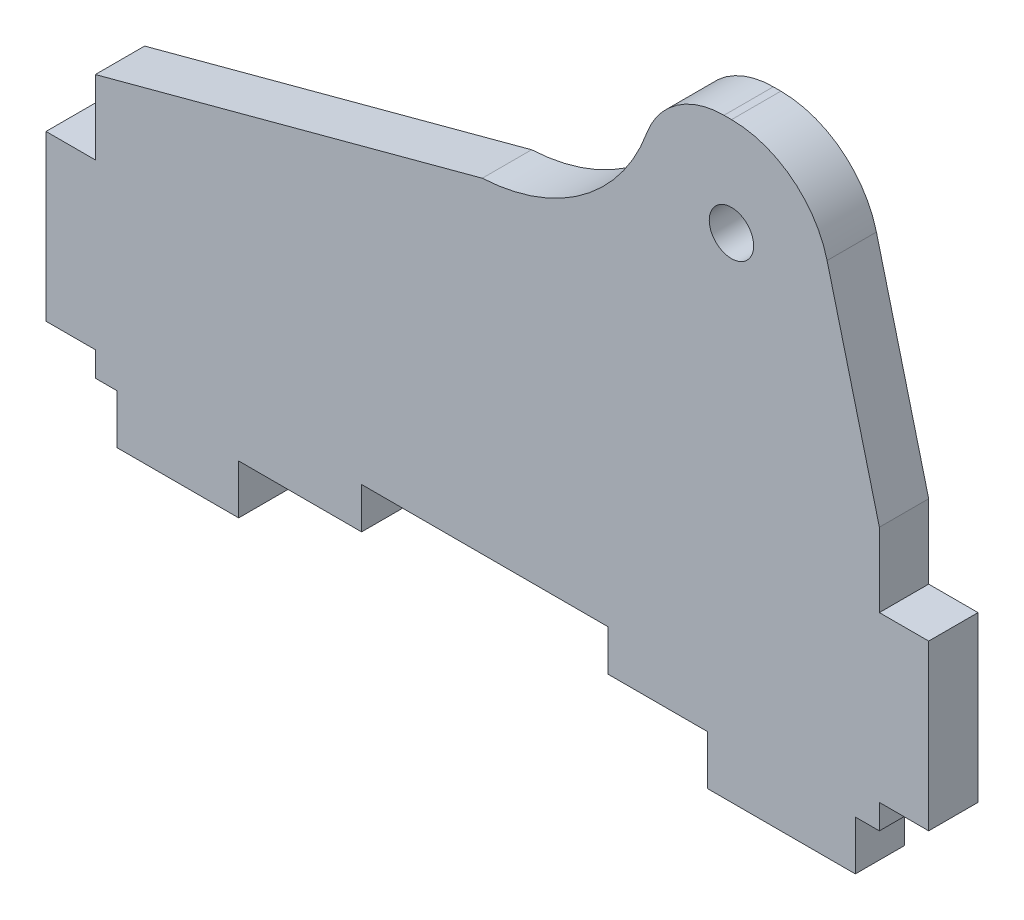
ISO-10303-21;
HEADER;
FILE_DESCRIPTION(('STEP AP214'),'2;1');
FILE_NAME('part.step','',(''),(''),'','','');
FILE_SCHEMA(('AUTOMOTIVE_DESIGN { 1 0 10303 214 1 1 1 1 }'));
ENDSEC;
DATA;
#1=APPLICATION_CONTEXT('core data for automotive mechanical design processes');
#2=APPLICATION_PROTOCOL_DEFINITION('international standard','automotive_design',2000,#1);
#3=PRODUCT_CONTEXT('',#1,'mechanical');
#4=PRODUCT('Part','Part','',(#3));
#5=PRODUCT_RELATED_PRODUCT_CATEGORY('part','',(#4));
#6=PRODUCT_DEFINITION_FORMATION('','',#4);
#7=PRODUCT_DEFINITION_CONTEXT('part definition',#1,'design');
#8=PRODUCT_DEFINITION('design','',#6,#7);
#9=PRODUCT_DEFINITION_SHAPE('','',#8);
#10=(LENGTH_UNIT() NAMED_UNIT(*) SI_UNIT(.MILLI.,.METRE.));
#11=(NAMED_UNIT(*) PLANE_ANGLE_UNIT() SI_UNIT($,.RADIAN.));
#12=(NAMED_UNIT(*) SI_UNIT($,.STERADIAN.) SOLID_ANGLE_UNIT());
#13=UNCERTAINTY_MEASURE_WITH_UNIT(LENGTH_MEASURE(1.E-05),#10,'distance_accuracy_value','');
#14=(GEOMETRIC_REPRESENTATION_CONTEXT(3) GLOBAL_UNCERTAINTY_ASSIGNED_CONTEXT((#13)) GLOBAL_UNIT_ASSIGNED_CONTEXT((#10,
#11,#12)) REPRESENTATION_CONTEXT('',''));
#15=CARTESIAN_POINT('',(0.,0.,0.));
#16=DIRECTION('',(0.,0.,1.));
#17=DIRECTION('',(1.,0.,0.));
#18=AXIS2_PLACEMENT_3D('',#15,#16,#17);
#19=CARTESIAN_POINT('',(41.246222878878,26.4756,3.));
#20=DIRECTION('',(0.,0.,-1.));
#21=DIRECTION('',(-1.,0.,0.));
#22=AXIS2_PLACEMENT_3D('',#19,#20,#21);
#23=CYLINDRICAL_SURFACE('',#22,4.99999999999999);
#24=CARTESIAN_POINT('',(41.246222878878,26.4756,0.));
#25=DIRECTION('',(0.,0.,-1.));
#26=DIRECTION('',(-1.,0.,0.));
#27=AXIS2_PLACEMENT_3D('',#24,#25,#26);
#28=CIRCLE('',#27,4.99999999999999);
#29=CARTESIAN_POINT('',(36.5489090063937,28.1888549090451,0.));
#30=VERTEX_POINT('',#29);
#31=CARTESIAN_POINT('',(41.246222878878,31.4756,0.));
#32=VERTEX_POINT('',#31);
#33=EDGE_CURVE('E260',#30,#32,#28,.T.);
#34=ORIENTED_EDGE('',*,*,#33,.F.);
#35=DIRECTION('',(0.,0.,-1.));
#36=VECTOR('',#35,1.);
#37=CARTESIAN_POINT('',(36.5489090063937,28.1888549090451,3.));
#38=LINE('',#37,#36);
#39=CARTESIAN_POINT('',(36.5489090063937,28.1888549090451,3.));
#40=VERTEX_POINT('',#39);
#41=EDGE_CURVE('E11',#40,#30,#38,.T.);
#42=ORIENTED_EDGE('',*,*,#41,.F.);
#43=CARTESIAN_POINT('',(41.246222878878,26.4756,3.));
#44=DIRECTION('',(0.,0.,-1.));
#45=DIRECTION('',(-1.,0.,0.));
#46=AXIS2_PLACEMENT_3D('',#43,#44,#45);
#47=CIRCLE('',#46,4.99999999999999);
#48=CARTESIAN_POINT('',(41.246222878878,31.4756,3.));
#49=VERTEX_POINT('',#48);
#50=EDGE_CURVE('E344',#40,#49,#47,.T.);
#51=ORIENTED_EDGE('',*,*,#50,.T.);
#52=DIRECTION('',(0.,0.,-1.));
#53=VECTOR('',#52,1.);
#54=CARTESIAN_POINT('',(41.246222878878,31.4756,3.));
#55=LINE('',#54,#53);
#56=EDGE_CURVE('E40',#49,#32,#55,.T.);
#57=ORIENTED_EDGE('',*,*,#56,.T.);
#58=EDGE_LOOP('',(#34,#42,#51,#57));
#59=FACE_BOUND('',#58,.T.);
#60=ADVANCED_FACE('F37',(#59),#23,.T.);
#61=CARTESIAN_POINT('',(25.9799527933042,32.0436784543967,3.));
#62=DIRECTION('',(0.,0.,-1.));
#63=DIRECTION('',(-1.,0.,0.));
#64=AXIS2_PLACEMENT_3D('',#61,#62,#63);
#65=CYLINDRICAL_SURFACE('',#64,11.25);
#66=CARTESIAN_POINT('',(25.9799527933042,32.0436784543967,0.));
#67=DIRECTION('',(0.,0.,1.));
#68=DIRECTION('',(1.,0.,0.));
#69=AXIS2_PLACEMENT_3D('',#66,#67,#68);
#70=CIRCLE('',#69,11.25);
#71=CARTESIAN_POINT('',(26.543543045695,20.807804388379,0.));
#72=VERTEX_POINT('',#71);
#73=EDGE_CURVE('E342',#72,#30,#70,.T.);
#74=ORIENTED_EDGE('',*,*,#73,.F.);
#75=DIRECTION('',(0.,0.,-1.));
#76=VECTOR('',#75,1.);
#77=CARTESIAN_POINT('',(26.543543045695,20.807804388379,3.));
#78=LINE('',#77,#76);
#79=CARTESIAN_POINT('',(26.543543045695,20.807804388379,3.));
#80=VERTEX_POINT('',#79);
#81=EDGE_CURVE('E46',#80,#72,#78,.T.);
#82=ORIENTED_EDGE('',*,*,#81,.F.);
#83=CARTESIAN_POINT('',(25.9799527933042,32.0436784543967,3.));
#84=DIRECTION('',(0.,0.,1.));
#85=DIRECTION('',(1.,0.,0.));
#86=AXIS2_PLACEMENT_3D('',#83,#84,#85);
#87=CIRCLE('',#86,11.25);
#88=EDGE_CURVE('E250',#80,#40,#87,.T.);
#89=ORIENTED_EDGE('',*,*,#88,.T.);
#90=ORIENTED_EDGE('',*,*,#41,.T.);
#91=EDGE_LOOP('',(#74,#82,#89,#90));
#92=FACE_BOUND('',#91,.T.);
#93=ADVANCED_FACE('F398',(#92),#65,.F.);
#94=CARTESIAN_POINT('',(3.,14.4996,3.));
#95=DIRECTION('',(-0.258808749652644,0.965928584887742,0.));
#96=DIRECTION('',(-0.965928584887742,-0.258808749652644,0.));
#97=AXIS2_PLACEMENT_3D('',#94,#95,#96);
#98=PLANE('',#97);
#99=DIRECTION('',(0.965928584887742,0.258808749652644,0.));
#100=VECTOR('',#99,1.);
#101=CARTESIAN_POINT('',(3.,14.4996,0.));
#102=LINE('',#101,#100);
#103=CARTESIAN_POINT('',(3.,14.4996,0.));
#104=VERTEX_POINT('',#103);
#105=EDGE_CURVE('E237',#104,#72,#102,.T.);
#106=ORIENTED_EDGE('',*,*,#105,.F.);
#107=DIRECTION('',(0.,0.,-1.));
#108=VECTOR('',#107,1.);
#109=CARTESIAN_POINT('',(3.,14.4996,3.));
#110=LINE('',#109,#108);
#111=CARTESIAN_POINT('',(3.,14.4996,3.));
#112=VERTEX_POINT('',#111);
#113=EDGE_CURVE('E232',#112,#104,#110,.T.);
#114=ORIENTED_EDGE('',*,*,#113,.F.);
#115=DIRECTION('',(0.965928584887742,0.258808749652644,0.));
#116=VECTOR('',#115,1.);
#117=CARTESIAN_POINT('',(3.,14.4996,3.));
#118=LINE('',#117,#116);
#119=EDGE_CURVE('E235',#112,#80,#118,.T.);
#120=ORIENTED_EDGE('',*,*,#119,.T.);
#121=ORIENTED_EDGE('',*,*,#81,.T.);
#122=EDGE_LOOP('',(#106,#114,#120,#121));
#123=FACE_BOUND('',#122,.T.);
#124=ADVANCED_FACE('F234',(#123),#98,.T.);
#125=CARTESIAN_POINT('',(3.,10.0003,3.));
#126=DIRECTION('',(-1.,0.,0.));
#127=DIRECTION('',(0.,0.,1.));
#128=AXIS2_PLACEMENT_3D('',#125,#126,#127);
#129=PLANE('',#128);
#130=DIRECTION('',(0.,1.,0.));
#131=VECTOR('',#130,1.);
#132=CARTESIAN_POINT('',(3.,10.0003,0.));
#133=LINE('',#132,#131);
#134=CARTESIAN_POINT('',(3.,10.0003,0.));
#135=VERTEX_POINT('',#134);
#136=EDGE_CURVE('E339',#135,#104,#133,.T.);
#137=ORIENTED_EDGE('',*,*,#136,.F.);
#138=DIRECTION('',(0.,0.,-1.));
#139=VECTOR('',#138,1.);
#140=CARTESIAN_POINT('',(3.,10.0003,3.));
#141=LINE('',#140,#139);
#142=CARTESIAN_POINT('',(3.,10.0003,3.));
#143=VERTEX_POINT('',#142);
#144=EDGE_CURVE('E242',#143,#135,#141,.T.);
#145=ORIENTED_EDGE('',*,*,#144,.F.);
#146=DIRECTION('',(0.,1.,0.));
#147=VECTOR('',#146,1.);
#148=CARTESIAN_POINT('',(3.,10.0003,3.));
#149=LINE('',#148,#147);
#150=EDGE_CURVE('E248',#143,#112,#149,.T.);
#151=ORIENTED_EDGE('',*,*,#150,.T.);
#152=ORIENTED_EDGE('',*,*,#113,.T.);
#153=EDGE_LOOP('',(#137,#145,#151,#152));
#154=FACE_BOUND('',#153,.T.);
#155=ADVANCED_FACE('F252',(#154),#129,.T.);
#156=CARTESIAN_POINT('',(0.,10.0003,3.));
#157=DIRECTION('',(0.,1.,0.));
#158=DIRECTION('',(0.,0.,1.));
#159=AXIS2_PLACEMENT_3D('',#156,#157,#158);
#160=PLANE('',#159);
#161=DIRECTION('',(1.,0.,0.));
#162=VECTOR('',#161,1.);
#163=CARTESIAN_POINT('',(0.,10.0003,0.));
#164=LINE('',#163,#162);
#165=CARTESIAN_POINT('',(0.,10.0003,0.));
#166=VERTEX_POINT('',#165);
#167=EDGE_CURVE('E336',#166,#135,#164,.T.);
#168=ORIENTED_EDGE('',*,*,#167,.F.);
#169=DIRECTION('',(0.,0.,-1.));
#170=VECTOR('',#169,1.);
#171=CARTESIAN_POINT('',(0.,10.0003,3.));
#172=LINE('',#171,#170);
#173=CARTESIAN_POINT('',(0.,10.0003,3.));
#174=VERTEX_POINT('',#173);
#175=EDGE_CURVE('E348',#174,#166,#172,.T.);
#176=ORIENTED_EDGE('',*,*,#175,.F.);
#177=DIRECTION('',(1.,0.,0.));
#178=VECTOR('',#177,1.);
#179=CARTESIAN_POINT('',(0.,10.0003,3.));
#180=LINE('',#179,#178);
#181=EDGE_CURVE('E253',#174,#143,#180,.T.);
#182=ORIENTED_EDGE('',*,*,#181,.T.);
#183=ORIENTED_EDGE('',*,*,#144,.T.);
#184=EDGE_LOOP('',(#168,#176,#182,#183));
#185=FACE_BOUND('',#184,.T.);
#186=ADVANCED_FACE('F411',(#185),#160,.T.);
#187=CARTESIAN_POINT('',(0.,0.,3.));
#188=DIRECTION('',(-1.,0.,0.));
#189=DIRECTION('',(0.,0.,1.));
#190=AXIS2_PLACEMENT_3D('',#187,#188,#189);
#191=PLANE('',#190);
#192=DIRECTION('',(0.,1.,0.));
#193=VECTOR('',#192,1.);
#194=CARTESIAN_POINT('',(0.,0.,0.));
#195=LINE('',#194,#193);
#196=CARTESIAN_POINT('',(0.,0.,0.));
#197=VERTEX_POINT('',#196);
#198=EDGE_CURVE('E333',#197,#166,#195,.T.);
#199=ORIENTED_EDGE('',*,*,#198,.F.);
#200=DIRECTION('',(0.,0.,-1.));
#201=VECTOR('',#200,1.);
#202=CARTESIAN_POINT('',(0.,0.,3.));
#203=LINE('',#202,#201);
#204=CARTESIAN_POINT('',(0.,0.,3.));
#205=VERTEX_POINT('',#204);
#206=EDGE_CURVE('E350',#205,#197,#203,.T.);
#207=ORIENTED_EDGE('',*,*,#206,.F.);
#208=DIRECTION('',(0.,1.,0.));
#209=VECTOR('',#208,1.);
#210=CARTESIAN_POINT('',(0.,0.,3.));
#211=LINE('',#210,#209);
#212=EDGE_CURVE('E255',#205,#174,#211,.T.);
#213=ORIENTED_EDGE('',*,*,#212,.T.);
#214=ORIENTED_EDGE('',*,*,#175,.T.);
#215=EDGE_LOOP('',(#199,#207,#213,#214));
#216=FACE_BOUND('',#215,.T.);
#217=ADVANCED_FACE('F414',(#216),#191,.T.);
#218=CARTESIAN_POINT('',(3.,0.,3.));
#219=DIRECTION('',(0.,-1.,0.));
#220=DIRECTION('',(0.,0.,-1.));
#221=AXIS2_PLACEMENT_3D('',#218,#219,#220);
#222=PLANE('',#221);
#223=DIRECTION('',(-1.,0.,0.));
#224=VECTOR('',#223,1.);
#225=CARTESIAN_POINT('',(3.,0.,0.));
#226=LINE('',#225,#224);
#227=CARTESIAN_POINT('',(3.,0.,0.));
#228=VERTEX_POINT('',#227);
#229=EDGE_CURVE('E330',#228,#197,#226,.T.);
#230=ORIENTED_EDGE('',*,*,#229,.F.);
#231=DIRECTION('',(0.,0.,-1.));
#232=VECTOR('',#231,1.);
#233=CARTESIAN_POINT('',(3.,0.,3.));
#234=LINE('',#233,#232);
#235=CARTESIAN_POINT('',(3.,0.,3.));
#236=VERTEX_POINT('',#235);
#237=EDGE_CURVE('E352',#236,#228,#234,.T.);
#238=ORIENTED_EDGE('',*,*,#237,.F.);
#239=DIRECTION('',(-1.,0.,0.));
#240=VECTOR('',#239,1.);
#241=CARTESIAN_POINT('',(3.,0.,3.));
#242=LINE('',#241,#240);
#243=EDGE_CURVE('E596',#236,#205,#242,.T.);
#244=ORIENTED_EDGE('',*,*,#243,.T.);
#245=ORIENTED_EDGE('',*,*,#206,.T.);
#246=EDGE_LOOP('',(#230,#238,#244,#245));
#247=FACE_BOUND('',#246,.T.);
#248=ADVANCED_FACE('F418',(#247),#222,.T.);
#249=CARTESIAN_POINT('',(3.,-1.5007,3.));
#250=DIRECTION('',(-1.,0.,0.));
#251=DIRECTION('',(0.,0.,1.));
#252=AXIS2_PLACEMENT_3D('',#249,#250,#251);
#253=PLANE('',#252);
#254=DIRECTION('',(0.,1.,0.));
#255=VECTOR('',#254,1.);
#256=CARTESIAN_POINT('',(3.,-1.5007,0.));
#257=LINE('',#256,#255);
#258=CARTESIAN_POINT('',(3.,-1.5007,0.));
#259=VERTEX_POINT('',#258);
#260=EDGE_CURVE('E327',#259,#228,#257,.T.);
#261=ORIENTED_EDGE('',*,*,#260,.F.);
#262=DIRECTION('',(0.,0.,-1.));
#263=VECTOR('',#262,1.);
#264=CARTESIAN_POINT('',(3.,-1.5007,3.));
#265=LINE('',#264,#263);
#266=CARTESIAN_POINT('',(3.,-1.5007,3.));
#267=VERTEX_POINT('',#266);
#268=EDGE_CURVE('E354',#267,#259,#265,.T.);
#269=ORIENTED_EDGE('',*,*,#268,.F.);
#270=DIRECTION('',(0.,1.,0.));
#271=VECTOR('',#270,1.);
#272=CARTESIAN_POINT('',(3.,-1.5007,3.));
#273=LINE('',#272,#271);
#274=EDGE_CURVE('E593',#267,#236,#273,.T.);
#275=ORIENTED_EDGE('',*,*,#274,.T.);
#276=ORIENTED_EDGE('',*,*,#237,.T.);
#277=EDGE_LOOP('',(#261,#269,#275,#276));
#278=FACE_BOUND('',#277,.T.);
#279=ADVANCED_FACE('F422',(#278),#253,.T.);
#280=CARTESIAN_POINT('',(4.3215,-1.5007,3.));
#281=DIRECTION('',(0.,-1.,0.));
#282=DIRECTION('',(0.,0.,-1.));
#283=AXIS2_PLACEMENT_3D('',#280,#281,#282);
#284=PLANE('',#283);
#285=DIRECTION('',(-1.,0.,0.));
#286=VECTOR('',#285,1.);
#287=CARTESIAN_POINT('',(4.3215,-1.5007,0.));
#288=LINE('',#287,#286);
#289=CARTESIAN_POINT('',(4.3215,-1.5007,0.));
#290=VERTEX_POINT('',#289);
#291=EDGE_CURVE('E324',#290,#259,#288,.T.);
#292=ORIENTED_EDGE('',*,*,#291,.F.);
#293=DIRECTION('',(0.,0.,-1.));
#294=VECTOR('',#293,1.);
#295=CARTESIAN_POINT('',(4.3215,-1.5007,3.));
#296=LINE('',#295,#294);
#297=CARTESIAN_POINT('',(4.3215,-1.5007,3.));
#298=VERTEX_POINT('',#297);
#299=EDGE_CURVE('E356',#298,#290,#296,.T.);
#300=ORIENTED_EDGE('',*,*,#299,.F.);
#301=DIRECTION('',(-1.,0.,0.));
#302=VECTOR('',#301,1.);
#303=CARTESIAN_POINT('',(4.3215,-1.5007,3.));
#304=LINE('',#303,#302);
#305=EDGE_CURVE('E590',#298,#267,#304,.T.);
#306=ORIENTED_EDGE('',*,*,#305,.T.);
#307=ORIENTED_EDGE('',*,*,#268,.T.);
#308=EDGE_LOOP('',(#292,#300,#306,#307));
#309=FACE_BOUND('',#308,.T.);
#310=ADVANCED_FACE('F426',(#309),#284,.T.);
#311=CARTESIAN_POINT('',(4.3215,-4.5007,3.));
#312=DIRECTION('',(-1.,0.,0.));
#313=DIRECTION('',(0.,0.,1.));
#314=AXIS2_PLACEMENT_3D('',#311,#312,#313);
#315=PLANE('',#314);
#316=DIRECTION('',(0.,1.,0.));
#317=VECTOR('',#316,1.);
#318=CARTESIAN_POINT('',(4.3215,-4.5007,0.));
#319=LINE('',#318,#317);
#320=CARTESIAN_POINT('',(4.3215,-4.5007,0.));
#321=VERTEX_POINT('',#320);
#322=EDGE_CURVE('E321',#321,#290,#319,.T.);
#323=ORIENTED_EDGE('',*,*,#322,.F.);
#324=DIRECTION('',(0.,0.,-1.));
#325=VECTOR('',#324,1.);
#326=CARTESIAN_POINT('',(4.3215,-4.5007,3.));
#327=LINE('',#326,#325);
#328=CARTESIAN_POINT('',(4.3215,-4.5007,3.));
#329=VERTEX_POINT('',#328);
#330=EDGE_CURVE('E358',#329,#321,#327,.T.);
#331=ORIENTED_EDGE('',*,*,#330,.F.);
#332=DIRECTION('',(0.,1.,0.));
#333=VECTOR('',#332,1.);
#334=CARTESIAN_POINT('',(4.3215,-4.5007,3.));
#335=LINE('',#334,#333);
#336=EDGE_CURVE('E587',#329,#298,#335,.T.);
#337=ORIENTED_EDGE('',*,*,#336,.T.);
#338=ORIENTED_EDGE('',*,*,#299,.T.);
#339=EDGE_LOOP('',(#323,#331,#337,#338));
#340=FACE_BOUND('',#339,.T.);
#341=ADVANCED_FACE('F430',(#340),#315,.T.);
#342=CARTESIAN_POINT('',(11.7217,-4.5007,3.));
#343=DIRECTION('',(0.,-1.,0.));
#344=DIRECTION('',(0.,0.,-1.));
#345=AXIS2_PLACEMENT_3D('',#342,#343,#344);
#346=PLANE('',#345);
#347=DIRECTION('',(-1.,0.,0.));
#348=VECTOR('',#347,1.);
#349=CARTESIAN_POINT('',(11.7217,-4.5007,0.));
#350=LINE('',#349,#348);
#351=CARTESIAN_POINT('',(11.7217,-4.5007,0.));
#352=VERTEX_POINT('',#351);
#353=EDGE_CURVE('E318',#352,#321,#350,.T.);
#354=ORIENTED_EDGE('',*,*,#353,.F.);
#355=DIRECTION('',(0.,0.,-1.));
#356=VECTOR('',#355,1.);
#357=CARTESIAN_POINT('',(11.7217,-4.5007,3.));
#358=LINE('',#357,#356);
#359=CARTESIAN_POINT('',(11.7217,-4.5007,3.));
#360=VERTEX_POINT('',#359);
#361=EDGE_CURVE('E360',#360,#352,#358,.T.);
#362=ORIENTED_EDGE('',*,*,#361,.F.);
#363=DIRECTION('',(-1.,0.,0.));
#364=VECTOR('',#363,1.);
#365=CARTESIAN_POINT('',(11.7217,-4.5007,3.));
#366=LINE('',#365,#364);
#367=EDGE_CURVE('E584',#360,#329,#366,.T.);
#368=ORIENTED_EDGE('',*,*,#367,.T.);
#369=ORIENTED_EDGE('',*,*,#330,.T.);
#370=EDGE_LOOP('',(#354,#362,#368,#369));
#371=FACE_BOUND('',#370,.T.);
#372=ADVANCED_FACE('F434',(#371),#346,.T.);
#373=CARTESIAN_POINT('',(11.7217,-1.4993,3.));
#374=DIRECTION('',(1.,0.,0.));
#375=DIRECTION('',(0.,0.,-1.));
#376=AXIS2_PLACEMENT_3D('',#373,#374,#375);
#377=PLANE('',#376);
#378=DIRECTION('',(0.,-1.,0.));
#379=VECTOR('',#378,1.);
#380=CARTESIAN_POINT('',(11.7217,-1.4993,0.));
#381=LINE('',#380,#379);
#382=CARTESIAN_POINT('',(11.7217,-1.4993,0.));
#383=VERTEX_POINT('',#382);
#384=EDGE_CURVE('E315',#383,#352,#381,.T.);
#385=ORIENTED_EDGE('',*,*,#384,.F.);
#386=DIRECTION('',(0.,0.,-1.));
#387=VECTOR('',#386,1.);
#388=CARTESIAN_POINT('',(11.7217,-1.4993,3.));
#389=LINE('',#388,#387);
#390=CARTESIAN_POINT('',(11.7217,-1.4993,3.));
#391=VERTEX_POINT('',#390);
#392=EDGE_CURVE('E362',#391,#383,#389,.T.);
#393=ORIENTED_EDGE('',*,*,#392,.F.);
#394=DIRECTION('',(0.,-1.,0.));
#395=VECTOR('',#394,1.);
#396=CARTESIAN_POINT('',(11.7217,-1.4993,3.));
#397=LINE('',#396,#395);
#398=EDGE_CURVE('E581',#391,#360,#397,.T.);
#399=ORIENTED_EDGE('',*,*,#398,.T.);
#400=ORIENTED_EDGE('',*,*,#361,.T.);
#401=EDGE_LOOP('',(#385,#393,#399,#400));
#402=FACE_BOUND('',#401,.T.);
#403=ADVANCED_FACE('F438',(#402),#377,.T.);
#404=CARTESIAN_POINT('',(19.2003,-1.4993,3.));
#405=DIRECTION('',(0.,-1.,0.));
#406=DIRECTION('',(0.,0.,-1.));
#407=AXIS2_PLACEMENT_3D('',#404,#405,#406);
#408=PLANE('',#407);
#409=DIRECTION('',(-1.,0.,0.));
#410=VECTOR('',#409,1.);
#411=CARTESIAN_POINT('',(19.2003,-1.4993,0.));
#412=LINE('',#411,#410);
#413=CARTESIAN_POINT('',(19.2003,-1.4993,0.));
#414=VERTEX_POINT('',#413);
#415=EDGE_CURVE('E312',#414,#383,#412,.T.);
#416=ORIENTED_EDGE('',*,*,#415,.F.);
#417=DIRECTION('',(0.,0.,-1.));
#418=VECTOR('',#417,1.);
#419=CARTESIAN_POINT('',(19.2003,-1.4993,3.));
#420=LINE('',#419,#418);
#421=CARTESIAN_POINT('',(19.2003,-1.4993,3.));
#422=VERTEX_POINT('',#421);
#423=EDGE_CURVE('E364',#422,#414,#420,.T.);
#424=ORIENTED_EDGE('',*,*,#423,.F.);
#425=DIRECTION('',(-1.,0.,0.));
#426=VECTOR('',#425,1.);
#427=CARTESIAN_POINT('',(19.2003,-1.4993,3.));
#428=LINE('',#427,#426);
#429=EDGE_CURVE('E578',#422,#391,#428,.T.);
#430=ORIENTED_EDGE('',*,*,#429,.T.);
#431=ORIENTED_EDGE('',*,*,#392,.T.);
#432=EDGE_LOOP('',(#416,#424,#430,#431));
#433=FACE_BOUND('',#432,.T.);
#434=ADVANCED_FACE('F442',(#433),#408,.T.);
#435=CARTESIAN_POINT('',(19.2003,1.0005,3.));
#436=DIRECTION('',(1.,0.,0.));
#437=DIRECTION('',(0.,0.,-1.));
#438=AXIS2_PLACEMENT_3D('',#435,#436,#437);
#439=PLANE('',#438);
#440=DIRECTION('',(0.,-1.,0.));
#441=VECTOR('',#440,1.);
#442=CARTESIAN_POINT('',(19.2003,1.0005,0.));
#443=LINE('',#442,#441);
#444=CARTESIAN_POINT('',(19.2003,1.0005,0.));
#445=VERTEX_POINT('',#444);
#446=EDGE_CURVE('E309',#445,#414,#443,.T.);
#447=ORIENTED_EDGE('',*,*,#446,.F.);
#448=DIRECTION('',(0.,0.,-1.));
#449=VECTOR('',#448,1.);
#450=CARTESIAN_POINT('',(19.2003,1.0005,3.));
#451=LINE('',#450,#449);
#452=CARTESIAN_POINT('',(19.2003,1.0005,3.));
#453=VERTEX_POINT('',#452);
#454=EDGE_CURVE('E366',#453,#445,#451,.T.);
#455=ORIENTED_EDGE('',*,*,#454,.F.);
#456=DIRECTION('',(0.,-1.,0.));
#457=VECTOR('',#456,1.);
#458=CARTESIAN_POINT('',(19.2003,1.0005,3.));
#459=LINE('',#458,#457);
#460=EDGE_CURVE('E575',#453,#422,#459,.T.);
#461=ORIENTED_EDGE('',*,*,#460,.T.);
#462=ORIENTED_EDGE('',*,*,#423,.T.);
#463=EDGE_LOOP('',(#447,#455,#461,#462));
#464=FACE_BOUND('',#463,.T.);
#465=ADVANCED_FACE('F446',(#464),#439,.T.);
#466=CARTESIAN_POINT('',(34.2002,1.0005,3.));
#467=DIRECTION('',(0.,-1.,0.));
#468=DIRECTION('',(0.,0.,-1.));
#469=AXIS2_PLACEMENT_3D('',#466,#467,#468);
#470=PLANE('',#469);
#471=DIRECTION('',(-1.,0.,0.));
#472=VECTOR('',#471,1.);
#473=CARTESIAN_POINT('',(34.2002,1.0005,0.));
#474=LINE('',#473,#472);
#475=CARTESIAN_POINT('',(34.2002,1.0005,0.));
#476=VERTEX_POINT('',#475);
#477=EDGE_CURVE('E306',#476,#445,#474,.T.);
#478=ORIENTED_EDGE('',*,*,#477,.F.);
#479=DIRECTION('',(0.,0.,-1.));
#480=VECTOR('',#479,1.);
#481=CARTESIAN_POINT('',(34.2002,1.0005,3.));
#482=LINE('',#481,#480);
#483=CARTESIAN_POINT('',(34.2002,1.0005,3.));
#484=VERTEX_POINT('',#483);
#485=EDGE_CURVE('E368',#484,#476,#482,.T.);
#486=ORIENTED_EDGE('',*,*,#485,.F.);
#487=DIRECTION('',(-1.,0.,0.));
#488=VECTOR('',#487,1.);
#489=CARTESIAN_POINT('',(34.2002,1.0005,3.));
#490=LINE('',#489,#488);
#491=EDGE_CURVE('E572',#484,#453,#490,.T.);
#492=ORIENTED_EDGE('',*,*,#491,.T.);
#493=ORIENTED_EDGE('',*,*,#454,.T.);
#494=EDGE_LOOP('',(#478,#486,#492,#493));
#495=FACE_BOUND('',#494,.T.);
#496=ADVANCED_FACE('F450',(#495),#470,.T.);
#497=CARTESIAN_POINT('',(34.2002,-1.4993,3.));
#498=DIRECTION('',(-1.,0.,0.));
#499=DIRECTION('',(0.,0.,1.));
#500=AXIS2_PLACEMENT_3D('',#497,#498,#499);
#501=PLANE('',#500);
#502=DIRECTION('',(0.,1.,0.));
#503=VECTOR('',#502,1.);
#504=CARTESIAN_POINT('',(34.2002,-1.4993,0.));
#505=LINE('',#504,#503);
#506=CARTESIAN_POINT('',(34.2002,-1.4993,0.));
#507=VERTEX_POINT('',#506);
#508=EDGE_CURVE('E303',#507,#476,#505,.T.);
#509=ORIENTED_EDGE('',*,*,#508,.F.);
#510=DIRECTION('',(0.,0.,-1.));
#511=VECTOR('',#510,1.);
#512=CARTESIAN_POINT('',(34.2002,-1.4993,3.));
#513=LINE('',#512,#511);
#514=CARTESIAN_POINT('',(34.2002,-1.4993,3.));
#515=VERTEX_POINT('',#514);
#516=EDGE_CURVE('E370',#515,#507,#513,.T.);
#517=ORIENTED_EDGE('',*,*,#516,.F.);
#518=DIRECTION('',(0.,1.,0.));
#519=VECTOR('',#518,1.);
#520=CARTESIAN_POINT('',(34.2002,-1.4993,3.));
#521=LINE('',#520,#519);
#522=EDGE_CURVE('E569',#515,#484,#521,.T.);
#523=ORIENTED_EDGE('',*,*,#522,.T.);
#524=ORIENTED_EDGE('',*,*,#485,.T.);
#525=EDGE_LOOP('',(#509,#517,#523,#524));
#526=FACE_BOUND('',#525,.T.);
#527=ADVANCED_FACE('F454',(#526),#501,.T.);
#528=CARTESIAN_POINT('',(40.2392,-1.4993,3.));
#529=DIRECTION('',(0.,-1.,0.));
#530=DIRECTION('',(0.,0.,-1.));
#531=AXIS2_PLACEMENT_3D('',#528,#529,#530);
#532=PLANE('',#531);
#533=DIRECTION('',(-1.,0.,0.));
#534=VECTOR('',#533,1.);
#535=CARTESIAN_POINT('',(40.2392,-1.4993,0.));
#536=LINE('',#535,#534);
#537=CARTESIAN_POINT('',(40.2392,-1.4993,0.));
#538=VERTEX_POINT('',#537);
#539=EDGE_CURVE('E300',#538,#507,#536,.T.);
#540=ORIENTED_EDGE('',*,*,#539,.F.);
#541=DIRECTION('',(0.,0.,-1.));
#542=VECTOR('',#541,1.);
#543=CARTESIAN_POINT('',(40.2392,-1.4993,3.));
#544=LINE('',#543,#542);
#545=CARTESIAN_POINT('',(40.2392,-1.4993,3.));
#546=VERTEX_POINT('',#545);
#547=EDGE_CURVE('E372',#546,#538,#544,.T.);
#548=ORIENTED_EDGE('',*,*,#547,.F.);
#549=DIRECTION('',(-1.,0.,0.));
#550=VECTOR('',#549,1.);
#551=CARTESIAN_POINT('',(40.2392,-1.4993,3.));
#552=LINE('',#551,#550);
#553=EDGE_CURVE('E566',#546,#515,#552,.T.);
#554=ORIENTED_EDGE('',*,*,#553,.T.);
#555=ORIENTED_EDGE('',*,*,#516,.T.);
#556=EDGE_LOOP('',(#540,#548,#554,#555));
#557=FACE_BOUND('',#556,.T.);
#558=ADVANCED_FACE('F458',(#557),#532,.T.);
#559=CARTESIAN_POINT('',(40.2392,-4.5007,3.));
#560=DIRECTION('',(-1.,0.,0.));
#561=DIRECTION('',(0.,0.,1.));
#562=AXIS2_PLACEMENT_3D('',#559,#560,#561);
#563=PLANE('',#562);
#564=DIRECTION('',(0.,1.,0.));
#565=VECTOR('',#564,1.);
#566=CARTESIAN_POINT('',(40.2392,-4.5007,0.));
#567=LINE('',#566,#565);
#568=CARTESIAN_POINT('',(40.2392,-4.5007,0.));
#569=VERTEX_POINT('',#568);
#570=EDGE_CURVE('E297',#569,#538,#567,.T.);
#571=ORIENTED_EDGE('',*,*,#570,.F.);
#572=DIRECTION('',(0.,0.,-1.));
#573=VECTOR('',#572,1.);
#574=CARTESIAN_POINT('',(40.2392,-4.5007,3.));
#575=LINE('',#574,#573);
#576=CARTESIAN_POINT('',(40.2392,-4.5007,3.));
#577=VERTEX_POINT('',#576);
#578=EDGE_CURVE('E374',#577,#569,#575,.T.);
#579=ORIENTED_EDGE('',*,*,#578,.F.);
#580=DIRECTION('',(0.,1.,0.));
#581=VECTOR('',#580,1.);
#582=CARTESIAN_POINT('',(40.2392,-4.5007,3.));
#583=LINE('',#582,#581);
#584=EDGE_CURVE('E563',#577,#546,#583,.T.);
#585=ORIENTED_EDGE('',*,*,#584,.T.);
#586=ORIENTED_EDGE('',*,*,#547,.T.);
#587=EDGE_LOOP('',(#571,#579,#585,#586));
#588=FACE_BOUND('',#587,.T.);
#589=ADVANCED_FACE('F462',(#588),#563,.T.);
#590=CARTESIAN_POINT('',(49.2382,-4.5007,3.));
#591=DIRECTION('',(0.,-1.,0.));
#592=DIRECTION('',(0.,0.,-1.));
#593=AXIS2_PLACEMENT_3D('',#590,#591,#592);
#594=PLANE('',#593);
#595=DIRECTION('',(-1.,0.,0.));
#596=VECTOR('',#595,1.);
#597=CARTESIAN_POINT('',(49.2382,-4.5007,0.));
#598=LINE('',#597,#596);
#599=CARTESIAN_POINT('',(49.2382,-4.5007,0.));
#600=VERTEX_POINT('',#599);
#601=EDGE_CURVE('E294',#600,#569,#598,.T.);
#602=ORIENTED_EDGE('',*,*,#601,.F.);
#603=DIRECTION('',(0.,0.,-1.));
#604=VECTOR('',#603,1.);
#605=CARTESIAN_POINT('',(49.2382,-4.5007,3.));
#606=LINE('',#605,#604);
#607=CARTESIAN_POINT('',(49.2382,-4.5007,3.));
#608=VERTEX_POINT('',#607);
#609=EDGE_CURVE('E376',#608,#600,#606,.T.);
#610=ORIENTED_EDGE('',*,*,#609,.F.);
#611=DIRECTION('',(-1.,0.,0.));
#612=VECTOR('',#611,1.);
#613=CARTESIAN_POINT('',(49.2382,-4.5007,3.));
#614=LINE('',#613,#612);
#615=EDGE_CURVE('E560',#608,#577,#614,.T.);
#616=ORIENTED_EDGE('',*,*,#615,.T.);
#617=ORIENTED_EDGE('',*,*,#578,.T.);
#618=EDGE_LOOP('',(#602,#610,#616,#617));
#619=FACE_BOUND('',#618,.T.);
#620=ADVANCED_FACE('F466',(#619),#594,.T.);
#621=CARTESIAN_POINT('',(49.2382,-1.5007,3.));
#622=DIRECTION('',(1.,0.,0.));
#623=DIRECTION('',(0.,0.,-1.));
#624=AXIS2_PLACEMENT_3D('',#621,#622,#623);
#625=PLANE('',#624);
#626=DIRECTION('',(0.,-1.,0.));
#627=VECTOR('',#626,1.);
#628=CARTESIAN_POINT('',(49.2382,-1.5007,0.));
#629=LINE('',#628,#627);
#630=CARTESIAN_POINT('',(49.2382,-1.5007,0.));
#631=VERTEX_POINT('',#630);
#632=EDGE_CURVE('E291',#631,#600,#629,.T.);
#633=ORIENTED_EDGE('',*,*,#632,.F.);
#634=DIRECTION('',(0.,0.,-1.));
#635=VECTOR('',#634,1.);
#636=CARTESIAN_POINT('',(49.2382,-1.5007,3.));
#637=LINE('',#636,#635);
#638=CARTESIAN_POINT('',(49.2382,-1.5007,3.));
#639=VERTEX_POINT('',#638);
#640=EDGE_CURVE('E378',#639,#631,#637,.T.);
#641=ORIENTED_EDGE('',*,*,#640,.F.);
#642=DIRECTION('',(0.,-1.,0.));
#643=VECTOR('',#642,1.);
#644=CARTESIAN_POINT('',(49.2382,-1.5007,3.));
#645=LINE('',#644,#643);
#646=EDGE_CURVE('E557',#639,#608,#645,.T.);
#647=ORIENTED_EDGE('',*,*,#646,.T.);
#648=ORIENTED_EDGE('',*,*,#609,.T.);
#649=EDGE_LOOP('',(#633,#641,#647,#648));
#650=FACE_BOUND('',#649,.T.);
#651=ADVANCED_FACE('F470',(#650),#625,.T.);
#652=CARTESIAN_POINT('',(50.6992,-1.5007,3.));
#653=DIRECTION('',(0.,-1.,0.));
#654=DIRECTION('',(0.,0.,-1.));
#655=AXIS2_PLACEMENT_3D('',#652,#653,#654);
#656=PLANE('',#655);
#657=DIRECTION('',(-1.,0.,0.));
#658=VECTOR('',#657,1.);
#659=CARTESIAN_POINT('',(50.6992,-1.5007,0.));
#660=LINE('',#659,#658);
#661=CARTESIAN_POINT('',(50.6992,-1.5007,0.));
#662=VERTEX_POINT('',#661);
#663=EDGE_CURVE('E288',#662,#631,#660,.T.);
#664=ORIENTED_EDGE('',*,*,#663,.F.);
#665=DIRECTION('',(0.,0.,-1.));
#666=VECTOR('',#665,1.);
#667=CARTESIAN_POINT('',(50.6992,-1.5007,3.));
#668=LINE('',#667,#666);
#669=CARTESIAN_POINT('',(50.6992,-1.5007,3.));
#670=VERTEX_POINT('',#669);
#671=EDGE_CURVE('E380',#670,#662,#668,.T.);
#672=ORIENTED_EDGE('',*,*,#671,.F.);
#673=DIRECTION('',(-1.,0.,0.));
#674=VECTOR('',#673,1.);
#675=CARTESIAN_POINT('',(50.6992,-1.5007,3.));
#676=LINE('',#675,#674);
#677=EDGE_CURVE('E554',#670,#639,#676,.T.);
#678=ORIENTED_EDGE('',*,*,#677,.T.);
#679=ORIENTED_EDGE('',*,*,#640,.T.);
#680=EDGE_LOOP('',(#664,#672,#678,#679));
#681=FACE_BOUND('',#680,.T.);
#682=ADVANCED_FACE('F474',(#681),#656,.T.);
#683=CARTESIAN_POINT('',(50.6992,0.,3.));
#684=DIRECTION('',(1.,0.,0.));
#685=DIRECTION('',(0.,0.,-1.));
#686=AXIS2_PLACEMENT_3D('',#683,#684,#685);
#687=PLANE('',#686);
#688=DIRECTION('',(0.,-1.,0.));
#689=VECTOR('',#688,1.);
#690=CARTESIAN_POINT('',(50.6992,0.,0.));
#691=LINE('',#690,#689);
#692=CARTESIAN_POINT('',(50.6992,0.,0.));
#693=VERTEX_POINT('',#692);
#694=EDGE_CURVE('E285',#693,#662,#691,.T.);
#695=ORIENTED_EDGE('',*,*,#694,.F.);
#696=DIRECTION('',(0.,0.,-1.));
#697=VECTOR('',#696,1.);
#698=CARTESIAN_POINT('',(50.6992,0.,3.));
#699=LINE('',#698,#697);
#700=CARTESIAN_POINT('',(50.6992,0.,3.));
#701=VERTEX_POINT('',#700);
#702=EDGE_CURVE('E382',#701,#693,#699,.T.);
#703=ORIENTED_EDGE('',*,*,#702,.F.);
#704=DIRECTION('',(0.,-1.,0.));
#705=VECTOR('',#704,1.);
#706=CARTESIAN_POINT('',(50.6992,0.,3.));
#707=LINE('',#706,#705);
#708=EDGE_CURVE('E551',#701,#670,#707,.T.);
#709=ORIENTED_EDGE('',*,*,#708,.T.);
#710=ORIENTED_EDGE('',*,*,#671,.T.);
#711=EDGE_LOOP('',(#695,#703,#709,#710));
#712=FACE_BOUND('',#711,.T.);
#713=ADVANCED_FACE('F478',(#712),#687,.T.);
#714=CARTESIAN_POINT('',(53.6991999999829,0.,3.));
#715=DIRECTION('',(0.,-1.,0.));
#716=DIRECTION('',(0.,0.,-1.));
#717=AXIS2_PLACEMENT_3D('',#714,#715,#716);
#718=PLANE('',#717);
#719=DIRECTION('',(-1.,0.,0.));
#720=VECTOR('',#719,1.);
#721=CARTESIAN_POINT('',(53.6991999999829,0.,0.));
#722=LINE('',#721,#720);
#723=CARTESIAN_POINT('',(53.6991999999829,0.,0.));
#724=VERTEX_POINT('',#723);
#725=EDGE_CURVE('E282',#724,#693,#722,.T.);
#726=ORIENTED_EDGE('',*,*,#725,.F.);
#727=DIRECTION('',(0.,0.,-1.));
#728=VECTOR('',#727,1.);
#729=CARTESIAN_POINT('',(53.6991999999829,0.,3.));
#730=LINE('',#729,#728);
#731=CARTESIAN_POINT('',(53.6991999999829,0.,3.));
#732=VERTEX_POINT('',#731);
#733=EDGE_CURVE('E384',#732,#724,#730,.T.);
#734=ORIENTED_EDGE('',*,*,#733,.F.);
#735=DIRECTION('',(-1.,0.,0.));
#736=VECTOR('',#735,1.);
#737=CARTESIAN_POINT('',(53.6991999999829,0.,3.));
#738=LINE('',#737,#736);
#739=EDGE_CURVE('E548',#732,#701,#738,.T.);
#740=ORIENTED_EDGE('',*,*,#739,.T.);
#741=ORIENTED_EDGE('',*,*,#702,.T.);
#742=EDGE_LOOP('',(#726,#734,#740,#741));
#743=FACE_BOUND('',#742,.T.);
#744=ADVANCED_FACE('F482',(#743),#718,.T.);
#745=CARTESIAN_POINT('',(53.6991999999829,10.0003,3.));
#746=DIRECTION('',(1.,0.,0.));
#747=DIRECTION('',(0.,0.,-1.));
#748=AXIS2_PLACEMENT_3D('',#745,#746,#747);
#749=PLANE('',#748);
#750=DIRECTION('',(0.,-1.,0.));
#751=VECTOR('',#750,1.);
#752=CARTESIAN_POINT('',(53.6991999999829,10.0003,0.));
#753=LINE('',#752,#751);
#754=CARTESIAN_POINT('',(53.6991999999829,10.0003,0.));
#755=VERTEX_POINT('',#754);
#756=EDGE_CURVE('E279',#755,#724,#753,.T.);
#757=ORIENTED_EDGE('',*,*,#756,.F.);
#758=DIRECTION('',(0.,0.,-1.));
#759=VECTOR('',#758,1.);
#760=CARTESIAN_POINT('',(53.6991999999829,10.0003,3.));
#761=LINE('',#760,#759);
#762=CARTESIAN_POINT('',(53.6991999999829,10.0003,3.));
#763=VERTEX_POINT('',#762);
#764=EDGE_CURVE('E386',#763,#755,#761,.T.);
#765=ORIENTED_EDGE('',*,*,#764,.F.);
#766=DIRECTION('',(0.,-1.,0.));
#767=VECTOR('',#766,1.);
#768=CARTESIAN_POINT('',(53.6991999999829,10.0003,3.));
#769=LINE('',#768,#767);
#770=EDGE_CURVE('E545',#763,#732,#769,.T.);
#771=ORIENTED_EDGE('',*,*,#770,.T.);
#772=ORIENTED_EDGE('',*,*,#733,.T.);
#773=EDGE_LOOP('',(#757,#765,#771,#772));
#774=FACE_BOUND('',#773,.T.);
#775=ADVANCED_FACE('F486',(#774),#749,.T.);
#776=CARTESIAN_POINT('',(50.6992,10.0003,3.));
#777=DIRECTION('',(0.,1.,0.));
#778=DIRECTION('',(0.,0.,1.));
#779=AXIS2_PLACEMENT_3D('',#776,#777,#778);
#780=PLANE('',#779);
#781=DIRECTION('',(1.,0.,0.));
#782=VECTOR('',#781,1.);
#783=CARTESIAN_POINT('',(50.6992,10.0003,0.));
#784=LINE('',#783,#782);
#785=CARTESIAN_POINT('',(50.6992,10.0003,0.));
#786=VERTEX_POINT('',#785);
#787=EDGE_CURVE('E276',#786,#755,#784,.T.);
#788=ORIENTED_EDGE('',*,*,#787,.F.);
#789=DIRECTION('',(0.,0.,-1.));
#790=VECTOR('',#789,1.);
#791=CARTESIAN_POINT('',(50.6992,10.0003,3.));
#792=LINE('',#791,#790);
#793=CARTESIAN_POINT('',(50.6992,10.0003,3.));
#794=VERTEX_POINT('',#793);
#795=EDGE_CURVE('E388',#794,#786,#792,.T.);
#796=ORIENTED_EDGE('',*,*,#795,.F.);
#797=DIRECTION('',(1.,0.,0.));
#798=VECTOR('',#797,1.);
#799=CARTESIAN_POINT('',(50.6992,10.0003,3.));
#800=LINE('',#799,#798);
#801=EDGE_CURVE('E542',#794,#763,#800,.T.);
#802=ORIENTED_EDGE('',*,*,#801,.T.);
#803=ORIENTED_EDGE('',*,*,#764,.T.);
#804=EDGE_LOOP('',(#788,#796,#802,#803));
#805=FACE_BOUND('',#804,.T.);
#806=ADVANCED_FACE('F490',(#805),#780,.T.);
#807=CARTESIAN_POINT('',(50.6992,14.4996,3.));
#808=DIRECTION('',(1.,0.,0.));
#809=DIRECTION('',(0.,0.,-1.));
#810=AXIS2_PLACEMENT_3D('',#807,#808,#809);
#811=PLANE('',#810);
#812=DIRECTION('',(0.,-1.,0.));
#813=VECTOR('',#812,1.);
#814=CARTESIAN_POINT('',(50.6992,14.4996,0.));
#815=LINE('',#814,#813);
#816=CARTESIAN_POINT('',(50.6992,14.4996,0.));
#817=VERTEX_POINT('',#816);
#818=EDGE_CURVE('E273',#817,#786,#815,.T.);
#819=ORIENTED_EDGE('',*,*,#818,.F.);
#820=DIRECTION('',(0.,0.,-1.));
#821=VECTOR('',#820,1.);
#822=CARTESIAN_POINT('',(50.6992,14.4996,3.));
#823=LINE('',#822,#821);
#824=CARTESIAN_POINT('',(50.6992,14.4996,3.));
#825=VERTEX_POINT('',#824);
#826=EDGE_CURVE('E390',#825,#817,#823,.T.);
#827=ORIENTED_EDGE('',*,*,#826,.F.);
#828=DIRECTION('',(0.,-1.,0.));
#829=VECTOR('',#828,1.);
#830=CARTESIAN_POINT('',(50.6992,14.4996,3.));
#831=LINE('',#830,#829);
#832=EDGE_CURVE('E539',#825,#794,#831,.T.);
#833=ORIENTED_EDGE('',*,*,#832,.T.);
#834=ORIENTED_EDGE('',*,*,#795,.T.);
#835=EDGE_LOOP('',(#819,#827,#833,#834));
#836=FACE_BOUND('',#835,.T.);
#837=ADVANCED_FACE('F494',(#836),#811,.T.);
#838=CARTESIAN_POINT('',(47.5193202550176,26.9593190120643,3.));
#839=DIRECTION('',(0.968942405885559,0.247286502010732,0.));
#840=DIRECTION('',(-0.247286502010732,0.968942405885559,0.));
#841=AXIS2_PLACEMENT_3D('',#838,#839,#840);
#842=PLANE('',#841);
#843=DIRECTION('',(0.247286502010732,-0.96894240588556,0.));
#844=VECTOR('',#843,1.);
#845=CARTESIAN_POINT('',(47.5193202550176,26.9593190120643,0.));
#846=LINE('',#845,#844);
#847=CARTESIAN_POINT('',(47.5193202550176,26.9593190120644,0.));
#848=VERTEX_POINT('',#847);
#849=EDGE_CURVE('E270',#848,#817,#846,.T.);
#850=ORIENTED_EDGE('',*,*,#849,.F.);
#851=DIRECTION('',(0.,0.,-1.));
#852=VECTOR('',#851,1.);
#853=CARTESIAN_POINT('',(47.5193202550176,26.9593190120644,3.));
#854=LINE('',#853,#852);
#855=CARTESIAN_POINT('',(47.5193202550176,26.9593190120644,3.));
#856=VERTEX_POINT('',#855);
#857=EDGE_CURVE('E392',#856,#848,#854,.T.);
#858=ORIENTED_EDGE('',*,*,#857,.F.);
#859=DIRECTION('',(0.247286502010732,-0.96894240588556,0.));
#860=VECTOR('',#859,1.);
#861=CARTESIAN_POINT('',(47.5193202550176,26.9593190120643,3.));
#862=LINE('',#861,#860);
#863=EDGE_CURVE('E536',#856,#825,#862,.T.);
#864=ORIENTED_EDGE('',*,*,#863,.T.);
#865=ORIENTED_EDGE('',*,*,#826,.T.);
#866=EDGE_LOOP('',(#850,#858,#864,#865));
#867=FACE_BOUND('',#866,.T.);
#868=ADVANCED_FACE('F498',(#867),#842,.T.);
#869=CARTESIAN_POINT('',(41.7056658197043,25.4756,3.));
#870=DIRECTION('',(0.,0.,-1.));
#871=DIRECTION('',(-1.,0.,0.));
#872=AXIS2_PLACEMENT_3D('',#869,#870,#871);
#873=CYLINDRICAL_SURFACE('',#872,5.99999999999999);
#874=CARTESIAN_POINT('',(41.7056658197043,25.4756,0.));
#875=DIRECTION('',(0.,0.,-1.));
#876=DIRECTION('',(-1.,0.,0.));
#877=AXIS2_PLACEMENT_3D('',#874,#875,#876);
#878=CIRCLE('',#877,5.99999999999999);
#879=CARTESIAN_POINT('',(41.7056658197043,31.4756,0.));
#880=VERTEX_POINT('',#879);
#881=EDGE_CURVE('E267',#880,#848,#878,.T.);
#882=ORIENTED_EDGE('',*,*,#881,.F.);
#883=DIRECTION('',(0.,0.,-1.));
#884=VECTOR('',#883,1.);
#885=CARTESIAN_POINT('',(41.7056658197043,31.4756,3.));
#886=LINE('',#885,#884);
#887=CARTESIAN_POINT('',(41.7056658197043,31.4756,3.));
#888=VERTEX_POINT('',#887);
#889=EDGE_CURVE('E393',#888,#880,#886,.T.);
#890=ORIENTED_EDGE('',*,*,#889,.F.);
#891=CARTESIAN_POINT('',(41.7056658197043,25.4756,3.));
#892=DIRECTION('',(0.,0.,-1.));
#893=DIRECTION('',(-1.,0.,0.));
#894=AXIS2_PLACEMENT_3D('',#891,#892,#893);
#895=CIRCLE('',#894,5.99999999999999);
#896=EDGE_CURVE('E533',#888,#856,#895,.T.);
#897=ORIENTED_EDGE('',*,*,#896,.T.);
#898=ORIENTED_EDGE('',*,*,#857,.T.);
#899=EDGE_LOOP('',(#882,#890,#897,#898));
#900=FACE_BOUND('',#899,.T.);
#901=ADVANCED_FACE('F502',(#900),#873,.T.);
#902=CARTESIAN_POINT('',(41.246222878878,31.4756,3.));
#903=DIRECTION('',(0.,1.,0.));
#904=DIRECTION('',(0.,0.,1.));
#905=AXIS2_PLACEMENT_3D('',#902,#903,#904);
#906=PLANE('',#905);
#907=DIRECTION('',(1.,0.,0.));
#908=VECTOR('',#907,1.);
#909=CARTESIAN_POINT('',(41.246222878878,31.4756,0.));
#910=LINE('',#909,#908);
#911=EDGE_CURVE('E263',#32,#880,#910,.T.);
#912=ORIENTED_EDGE('',*,*,#911,.F.);
#913=ORIENTED_EDGE('',*,*,#56,.F.);
#914=DIRECTION('',(1.,0.,0.));
#915=VECTOR('',#914,1.);
#916=CARTESIAN_POINT('',(41.246222878878,31.4756,3.));
#917=LINE('',#916,#915);
#918=EDGE_CURVE('E531',#49,#888,#917,.T.);
#919=ORIENTED_EDGE('',*,*,#918,.T.);
#920=ORIENTED_EDGE('',*,*,#889,.T.);
#921=EDGE_LOOP('',(#912,#913,#919,#920));
#922=FACE_BOUND('',#921,.T.);
#923=ADVANCED_FACE('F395',(#922),#906,.T.);
#924=CARTESIAN_POINT('',(41.246222878878,26.4756,3.));
#925=DIRECTION('',(0.,0.,-1.));
#926=DIRECTION('',(-1.,0.,0.));
#927=AXIS2_PLACEMENT_3D('',#924,#925,#926);
#928=PLANE('',#927);
#929=CARTESIAN_POINT('',(41.6992,25.49975,3.));
#930=DIRECTION('',(0.,0.,-1.));
#931=DIRECTION('',(1.,0.,0.));
#932=AXIS2_PLACEMENT_3D('',#929,#930,#931);
#933=CIRCLE('',#932,1.35);
#934=CARTESIAN_POINT('',(40.3492,25.49975,3.));
#935=VERTEX_POINT('',#934);
#936=EDGE_CURVE('E264',#935,#935,#933,.T.);
#937=ORIENTED_EDGE('',*,*,#936,.T.);
#938=EDGE_LOOP('',(#937));
#939=FACE_BOUND('',#938,.T.);
#940=ORIENTED_EDGE('',*,*,#50,.F.);
#941=ORIENTED_EDGE('',*,*,#88,.F.);
#942=ORIENTED_EDGE('',*,*,#119,.F.);
#943=ORIENTED_EDGE('',*,*,#150,.F.);
#944=ORIENTED_EDGE('',*,*,#181,.F.);
#945=ORIENTED_EDGE('',*,*,#212,.F.);
#946=ORIENTED_EDGE('',*,*,#243,.F.);
#947=ORIENTED_EDGE('',*,*,#274,.F.);
#948=ORIENTED_EDGE('',*,*,#305,.F.);
#949=ORIENTED_EDGE('',*,*,#336,.F.);
#950=ORIENTED_EDGE('',*,*,#367,.F.);
#951=ORIENTED_EDGE('',*,*,#398,.F.);
#952=ORIENTED_EDGE('',*,*,#429,.F.);
#953=ORIENTED_EDGE('',*,*,#460,.F.);
#954=ORIENTED_EDGE('',*,*,#491,.F.);
#955=ORIENTED_EDGE('',*,*,#522,.F.);
#956=ORIENTED_EDGE('',*,*,#553,.F.);
#957=ORIENTED_EDGE('',*,*,#584,.F.);
#958=ORIENTED_EDGE('',*,*,#615,.F.);
#959=ORIENTED_EDGE('',*,*,#646,.F.);
#960=ORIENTED_EDGE('',*,*,#677,.F.);
#961=ORIENTED_EDGE('',*,*,#708,.F.);
#962=ORIENTED_EDGE('',*,*,#739,.F.);
#963=ORIENTED_EDGE('',*,*,#770,.F.);
#964=ORIENTED_EDGE('',*,*,#801,.F.);
#965=ORIENTED_EDGE('',*,*,#832,.F.);
#966=ORIENTED_EDGE('',*,*,#863,.F.);
#967=ORIENTED_EDGE('',*,*,#896,.F.);
#968=ORIENTED_EDGE('',*,*,#918,.F.);
#969=EDGE_LOOP('',(#940,#941,#942,#943,#944,#945,#946,#947,#948,#949,#950,#951,#952,#953,#954,
#955,#956,#957,#958,#959,#960,#961,#962,#963,#964,#965,#966,#967,#968));
#970=FACE_BOUND('',#969,.T.);
#971=ADVANCED_FACE('F246',(#939,#970),#928,.F.);
#972=CARTESIAN_POINT('',(41.246222878878,26.4756,0.));
#973=DIRECTION('',(0.,0.,-1.));
#974=DIRECTION('',(-1.,0.,0.));
#975=AXIS2_PLACEMENT_3D('',#972,#973,#974);
#976=PLANE('',#975);
#977=CARTESIAN_POINT('',(41.6992,25.49975,0.));
#978=DIRECTION('',(0.,0.,-1.));
#979=DIRECTION('',(1.,0.,0.));
#980=AXIS2_PLACEMENT_3D('',#977,#978,#979);
#981=CIRCLE('',#980,1.35);
#982=CARTESIAN_POINT('',(40.3492,25.49975,0.));
#983=VERTEX_POINT('',#982);
#984=EDGE_CURVE('E526',#983,#983,#981,.T.);
#985=ORIENTED_EDGE('',*,*,#984,.F.);
#986=EDGE_LOOP('',(#985));
#987=FACE_BOUND('',#986,.T.);
#988=ORIENTED_EDGE('',*,*,#33,.T.);
#989=ORIENTED_EDGE('',*,*,#911,.T.);
#990=ORIENTED_EDGE('',*,*,#881,.T.);
#991=ORIENTED_EDGE('',*,*,#849,.T.);
#992=ORIENTED_EDGE('',*,*,#818,.T.);
#993=ORIENTED_EDGE('',*,*,#787,.T.);
#994=ORIENTED_EDGE('',*,*,#756,.T.);
#995=ORIENTED_EDGE('',*,*,#725,.T.);
#996=ORIENTED_EDGE('',*,*,#694,.T.);
#997=ORIENTED_EDGE('',*,*,#663,.T.);
#998=ORIENTED_EDGE('',*,*,#632,.T.);
#999=ORIENTED_EDGE('',*,*,#601,.T.);
#1000=ORIENTED_EDGE('',*,*,#570,.T.);
#1001=ORIENTED_EDGE('',*,*,#539,.T.);
#1002=ORIENTED_EDGE('',*,*,#508,.T.);
#1003=ORIENTED_EDGE('',*,*,#477,.T.);
#1004=ORIENTED_EDGE('',*,*,#446,.T.);
#1005=ORIENTED_EDGE('',*,*,#415,.T.);
#1006=ORIENTED_EDGE('',*,*,#384,.T.);
#1007=ORIENTED_EDGE('',*,*,#353,.T.);
#1008=ORIENTED_EDGE('',*,*,#322,.T.);
#1009=ORIENTED_EDGE('',*,*,#291,.T.);
#1010=ORIENTED_EDGE('',*,*,#260,.T.);
#1011=ORIENTED_EDGE('',*,*,#229,.T.);
#1012=ORIENTED_EDGE('',*,*,#198,.T.);
#1013=ORIENTED_EDGE('',*,*,#167,.T.);
#1014=ORIENTED_EDGE('',*,*,#136,.T.);
#1015=ORIENTED_EDGE('',*,*,#105,.T.);
#1016=ORIENTED_EDGE('',*,*,#73,.T.);
#1017=EDGE_LOOP('',(#988,#989,#990,#991,#992,#993,#994,#995,#996,#997,#998,#999,#1000,#1001,
#1002,#1003,#1004,#1005,#1006,#1007,#1008,#1009,#1010,#1011,#1012,#1013,#1014,#1015,#1016));
#1018=FACE_BOUND('',#1017,.T.);
#1019=ADVANCED_FACE('F397',(#987,#1018),#976,.T.);
#1020=CARTESIAN_POINT('',(41.6992,25.49975,3.));
#1021=DIRECTION('',(0.,0.,-1.));
#1022=DIRECTION('',(-1.,0.,0.));
#1023=AXIS2_PLACEMENT_3D('',#1020,#1021,#1022);
#1024=CYLINDRICAL_SURFACE('',#1023,1.35);
#1025=CARTESIAN_POINT('',(40.3492,25.49975,3.));
#1026=CARTESIAN_POINT('',(40.3492,25.49975,2.96875));
#1027=CARTESIAN_POINT('',(40.3492,25.49975,2.9375));
#1028=CARTESIAN_POINT('',(40.3492,25.49975,2.875));
#1029=CARTESIAN_POINT('',(40.3492,25.49975,2.84375));
#1030=CARTESIAN_POINT('',(40.3492,25.49975,2.78125));
#1031=CARTESIAN_POINT('',(40.3492,25.49975,2.75));
#1032=CARTESIAN_POINT('',(40.3492,25.49975,2.6875));
#1033=CARTESIAN_POINT('',(40.3492,25.49975,2.65625));
#1034=CARTESIAN_POINT('',(40.3492,25.49975,2.59375));
#1035=CARTESIAN_POINT('',(40.3492,25.49975,2.5625));
#1036=CARTESIAN_POINT('',(40.3492,25.49975,2.5));
#1037=CARTESIAN_POINT('',(40.3492,25.49975,2.46875));
#1038=CARTESIAN_POINT('',(40.3492,25.49975,2.40625));
#1039=CARTESIAN_POINT('',(40.3492,25.49975,2.375));
#1040=CARTESIAN_POINT('',(40.3492,25.49975,2.3125));
#1041=CARTESIAN_POINT('',(40.3492,25.49975,2.28125));
#1042=CARTESIAN_POINT('',(40.3492,25.49975,2.21875));
#1043=CARTESIAN_POINT('',(40.3492,25.49975,2.1875));
#1044=CARTESIAN_POINT('',(40.3492,25.49975,2.125));
#1045=CARTESIAN_POINT('',(40.3492,25.49975,2.09375));
#1046=CARTESIAN_POINT('',(40.3492,25.49975,2.03125));
#1047=CARTESIAN_POINT('',(40.3492,25.49975,2.));
#1048=CARTESIAN_POINT('',(40.3492,25.49975,1.9375));
#1049=CARTESIAN_POINT('',(40.3492,25.49975,1.90625));
#1050=CARTESIAN_POINT('',(40.3492,25.49975,1.84375));
#1051=CARTESIAN_POINT('',(40.3492,25.49975,1.8125));
#1052=CARTESIAN_POINT('',(40.3492,25.49975,1.75));
#1053=CARTESIAN_POINT('',(40.3492,25.49975,1.71875));
#1054=CARTESIAN_POINT('',(40.3492,25.49975,1.65625));
#1055=CARTESIAN_POINT('',(40.3492,25.49975,1.625));
#1056=CARTESIAN_POINT('',(40.3492,25.49975,1.5625));
#1057=CARTESIAN_POINT('',(40.3492,25.49975,1.53125));
#1058=CARTESIAN_POINT('',(40.3492,25.49975,1.46875));
#1059=CARTESIAN_POINT('',(40.3492,25.49975,1.4375));
#1060=CARTESIAN_POINT('',(40.3492,25.49975,1.375));
#1061=CARTESIAN_POINT('',(40.3492,25.49975,1.34375));
#1062=CARTESIAN_POINT('',(40.3492,25.49975,1.28125));
#1063=CARTESIAN_POINT('',(40.3492,25.49975,1.25));
#1064=CARTESIAN_POINT('',(40.3492,25.49975,1.1875));
#1065=CARTESIAN_POINT('',(40.3492,25.49975,1.15625));
#1066=CARTESIAN_POINT('',(40.3492,25.49975,1.09375));
#1067=CARTESIAN_POINT('',(40.3492,25.49975,1.0625));
#1068=CARTESIAN_POINT('',(40.3492,25.49975,1.));
#1069=CARTESIAN_POINT('',(40.3492,25.49975,0.96875));
#1070=CARTESIAN_POINT('',(40.3492,25.49975,0.90625));
#1071=CARTESIAN_POINT('',(40.3492,25.49975,0.875));
#1072=CARTESIAN_POINT('',(40.3492,25.49975,0.8125));
#1073=CARTESIAN_POINT('',(40.3492,25.49975,0.78125));
#1074=CARTESIAN_POINT('',(40.3492,25.49975,0.71875));
#1075=CARTESIAN_POINT('',(40.3492,25.49975,0.6875));
#1076=CARTESIAN_POINT('',(40.3492,25.49975,0.625));
#1077=CARTESIAN_POINT('',(40.3492,25.49975,0.59375));
#1078=CARTESIAN_POINT('',(40.3492,25.49975,0.53125));
#1079=CARTESIAN_POINT('',(40.3492,25.49975,0.5));
#1080=CARTESIAN_POINT('',(40.3492,25.49975,0.4375));
#1081=CARTESIAN_POINT('',(40.3492,25.49975,0.40625));
#1082=CARTESIAN_POINT('',(40.3492,25.49975,0.34375));
#1083=CARTESIAN_POINT('',(40.3492,25.49975,0.3125));
#1084=CARTESIAN_POINT('',(40.3492,25.49975,0.25));
#1085=CARTESIAN_POINT('',(40.3492,25.49975,0.21875));
#1086=CARTESIAN_POINT('',(40.3492,25.49975,0.15625));
#1087=CARTESIAN_POINT('',(40.3492,25.49975,0.125));
#1088=CARTESIAN_POINT('',(40.3492,25.49975,0.0625000000000001));
#1089=CARTESIAN_POINT('',(40.3492,25.49975,0.03125));
#1090=CARTESIAN_POINT('',(40.3492,25.49975,0.));
#1091=B_SPLINE_CURVE_WITH_KNOTS('',3,(#1025,#1026,#1027,#1028,#1029,#1030,#1031,#1032,#1033,
#1034,#1035,#1036,#1037,#1038,#1039,#1040,#1041,#1042,#1043,#1044,#1045,#1046,#1047,#1048,#1049,
#1050,#1051,#1052,#1053,#1054,#1055,#1056,#1057,#1058,#1059,#1060,#1061,#1062,#1063,#1064,#1065,
#1066,#1067,#1068,#1069,#1070,#1071,#1072,#1073,#1074,#1075,#1076,#1077,#1078,#1079,#1080,#1081,
#1082,#1083,#1084,#1085,#1086,#1087,#1088,#1089,#1090),.UNSPECIFIED.,.F.,.F.,(4,2,2,2,2,2,2,2,2,
2,2,2,2,2,2,2,2,2,2,2,2,2,2,2,2,2,2,2,2,2,2,2,4),(0.,0.0937499999999997,0.1875,0.28125,0.375,
0.46875,0.5625,0.65625,0.75,0.84375,0.9375,1.03125,1.125,1.21875,1.3125,1.40625,1.5,1.59375,
1.6875,1.78125,1.875,1.96875,2.0625,2.15625,2.25,2.34375,2.4375,2.53125,2.625,2.71875,2.8125,
2.90625,3.),.UNSPECIFIED.);
#1092=EDGE_CURVE('BSEAM514',#935,#983,#1091,.T.);
#1093=ORIENTED_EDGE('',*,*,#936,.F.);
#1094=ORIENTED_EDGE('',*,*,#984,.T.);
#1095=ORIENTED_EDGE('',*,*,#1092,.T.);
#1096=ORIENTED_EDGE('',*,*,#1092,.F.);
#1097=EDGE_LOOP('',(#1093,#1095,#1094,#1096));
#1098=FACE_BOUND('',#1097,.T.);
#1099=ADVANCED_FACE('F514',(#1098),#1024,.F.);
#1100=CLOSED_SHELL('',(#60,#93,#124,#155,#186,#217,#248,#279,#310,#341,#372,#403,#434,#465,#496,
#527,#558,#589,#620,#651,#682,#713,#744,#775,#806,#837,#868,#901,#923,#971,#1019,#1099));
#1101=MANIFOLD_SOLID_BREP('B2',#1100);
#1102=ADVANCED_BREP_SHAPE_REPRESENTATION('',(#18,#1101),#14);
#1103=SHAPE_DEFINITION_REPRESENTATION(#9,#1102);
ENDSEC;
END-ISO-10303-21;
